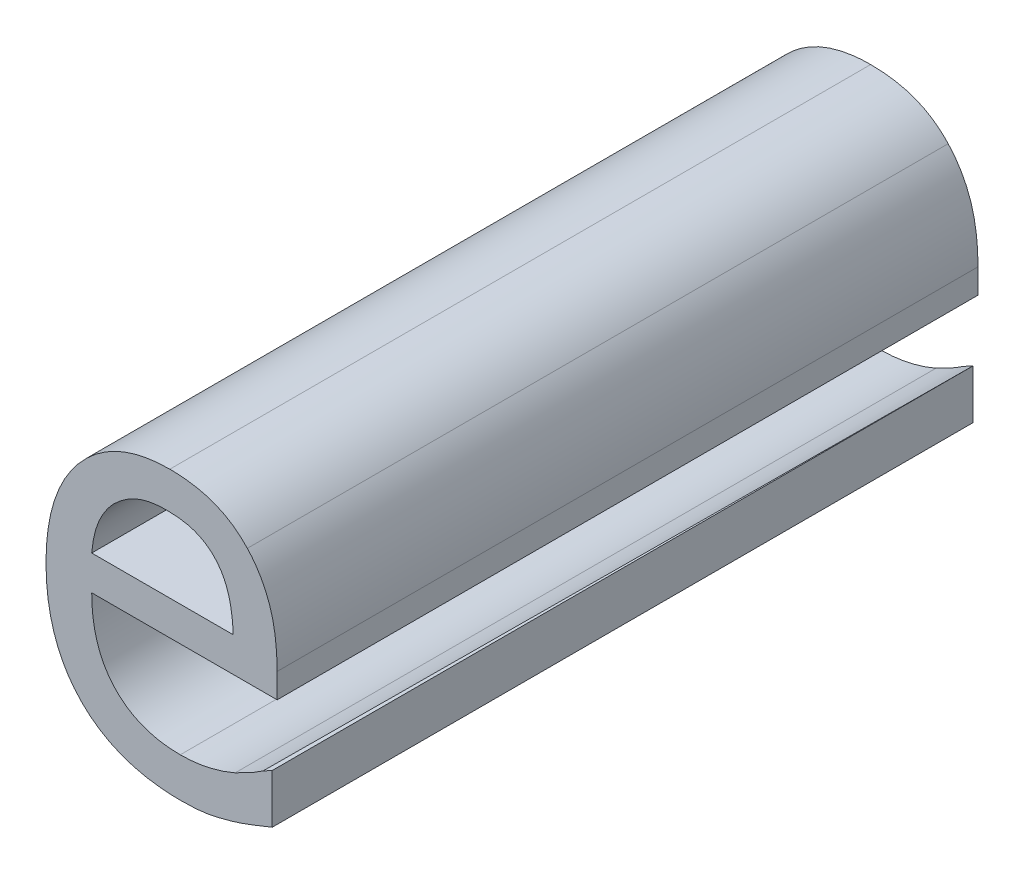
ISO-10303-21;
HEADER;
FILE_DESCRIPTION(('STEP AP214'),'2;1');
FILE_NAME('part.step','',(''),(''),'','','');
FILE_SCHEMA(('AUTOMOTIVE_DESIGN { 1 0 10303 214 1 1 1 1 }'));
ENDSEC;
DATA;
#1=APPLICATION_CONTEXT('core data for automotive mechanical design processes');
#2=APPLICATION_PROTOCOL_DEFINITION('international standard','automotive_design',2000,#1);
#3=PRODUCT_CONTEXT('',#1,'mechanical');
#4=PRODUCT('Part','Part','',(#3));
#5=PRODUCT_RELATED_PRODUCT_CATEGORY('part','',(#4));
#6=PRODUCT_DEFINITION_FORMATION('','',#4);
#7=PRODUCT_DEFINITION_CONTEXT('part definition',#1,'design');
#8=PRODUCT_DEFINITION('design','',#6,#7);
#9=PRODUCT_DEFINITION_SHAPE('','',#8);
#10=(LENGTH_UNIT() NAMED_UNIT(*) SI_UNIT(.MILLI.,.METRE.));
#11=(NAMED_UNIT(*) PLANE_ANGLE_UNIT() SI_UNIT($,.RADIAN.));
#12=(NAMED_UNIT(*) SI_UNIT($,.STERADIAN.) SOLID_ANGLE_UNIT());
#13=UNCERTAINTY_MEASURE_WITH_UNIT(LENGTH_MEASURE(1.E-05),#10,'distance_accuracy_value','');
#14=(GEOMETRIC_REPRESENTATION_CONTEXT(3) GLOBAL_UNCERTAINTY_ASSIGNED_CONTEXT((#13)) GLOBAL_UNIT_ASSIGNED_CONTEXT((#10,
#11,#12)) REPRESENTATION_CONTEXT('',''));
#15=CARTESIAN_POINT('',(0.,0.,0.));
#16=DIRECTION('',(0.,0.,1.));
#17=DIRECTION('',(1.,0.,0.));
#18=AXIS2_PLACEMENT_3D('',#15,#16,#17);
#19=CARTESIAN_POINT('',(-1.933754082946,-1.88252424241,0.));
#20=DIRECTION('',(0.,-1.,0.));
#21=DIRECTION('',(1.,0.,0.));
#22=AXIS2_PLACEMENT_3D('',#19,#20,#21);
#23=PLANE('',#22);
#24=DIRECTION('',(1.,0.,0.));
#25=VECTOR('',#24,1.);
#26=CARTESIAN_POINT('',(-1.928363909875,-1.88252424241,0.));
#27=LINE('',#26,#25);
#28=CARTESIAN_POINT('',(-1.933754082946,-1.88252424241,0.));
#29=VERTEX_POINT('',#28);
#30=CARTESIAN_POINT('',(-1.913569754734,-1.88252424241,0.));
#31=VERTEX_POINT('',#30);
#32=EDGE_CURVE('E11',#29,#31,#27,.T.);
#33=ORIENTED_EDGE('',*,*,#32,.F.);
#34=DIRECTION('',(0.,0.,1.));
#35=VECTOR('',#34,1.);
#36=CARTESIAN_POINT('',(-1.933754082946,-1.88252424241,0.));
#37=LINE('',#36,#35);
#38=CARTESIAN_POINT('',(-1.933754082946,-1.88252424241,0.1));
#39=VERTEX_POINT('',#38);
#40=EDGE_CURVE('E24',#29,#39,#37,.T.);
#41=ORIENTED_EDGE('',*,*,#40,.T.);
#42=DIRECTION('',(-1.,0.,0.));
#43=VECTOR('',#42,1.);
#44=CARTESIAN_POINT('',(-1.928363909875,-1.88252424241,0.1));
#45=LINE('',#44,#43);
#46=CARTESIAN_POINT('',(-1.913569754734,-1.88252424241,0.1));
#47=VERTEX_POINT('',#46);
#48=EDGE_CURVE('E572',#47,#39,#45,.T.);
#49=ORIENTED_EDGE('',*,*,#48,.F.);
#50=DIRECTION('',(0.,0.,1.));
#51=VECTOR('',#50,1.);
#52=CARTESIAN_POINT('',(-1.913569754734,-1.88252424241,0.));
#53=LINE('',#52,#51);
#54=EDGE_CURVE('E566',#31,#47,#53,.T.);
#55=ORIENTED_EDGE('',*,*,#54,.F.);
#56=EDGE_LOOP('',(#33,#41,#49,#55));
#57=FACE_BOUND('',#56,.T.);
#58=ADVANCED_FACE('F17',(#57),#23,.F.);
#59=CARTESIAN_POINT('',(-1.93061705034,-1.874888044621,0.));
#60=CARTESIAN_POINT('',(-1.93061705034,-1.874888044621,0.1));
#61=CARTESIAN_POINT('',(-1.932061736409,-1.876415284179,0.));
#62=CARTESIAN_POINT('',(-1.932061736409,-1.876415284179,0.1));
#63=CARTESIAN_POINT('',(-1.933547699222,-1.880088914467,0.));
#64=CARTESIAN_POINT('',(-1.933547699222,-1.880088914467,0.1));
#65=CARTESIAN_POINT('',(-1.933754082946,-1.88252424241,0.));
#66=CARTESIAN_POINT('',(-1.933754082946,-1.88252424241,0.1));
#67=B_SPLINE_SURFACE_WITH_KNOTS('',2,1,((#59,#60),(#61,#62),(#63,#64),(#65,#66)),.UNSPECIFIED.,
.F.,.F.,.F.,(3,1,3),(2,2),(0.,1.,2.),(0.,0.01),.UNSPECIFIED.);
#68=CARTESIAN_POINT('',(-1.93061705034,-1.874888044621,0.));
#69=CARTESIAN_POINT('',(-1.932061736409,-1.876415284179,0.));
#70=CARTESIAN_POINT('',(-1.933547699222,-1.880088914467,0.));
#71=CARTESIAN_POINT('',(-1.933754082946,-1.88252424241,0.));
#72=B_SPLINE_CURVE_WITH_KNOTS('',2,(#68,#69,#70,#71),.UNSPECIFIED.,.F.,.F.,(3,1,3),(0.,1.,2.),.UNSPECIFIED.);
#73=CARTESIAN_POINT('',(-1.93061705034,-1.874888044621,0.));
#74=VERTEX_POINT('',#73);
#75=EDGE_CURVE('E562',#74,#29,#72,.T.);
#76=DIRECTION('',(0.,0.,1.));
#77=VECTOR('',#76,1.);
#78=CARTESIAN_POINT('',(-1.93061705034,-1.874888044621,0.));
#79=LINE('',#78,#77);
#80=CARTESIAN_POINT('',(-1.93061705034,-1.874888044621,0.1));
#81=VERTEX_POINT('',#80);
#82=EDGE_CURVE('E556',#74,#81,#79,.T.);
#83=CARTESIAN_POINT('',(-1.933754082946,-1.88252424241,0.1));
#84=CARTESIAN_POINT('',(-1.933547699222,-1.880088914467,0.1));
#85=CARTESIAN_POINT('',(-1.932061736409,-1.876415284179,0.1));
#86=CARTESIAN_POINT('',(-1.93061705034,-1.874888044621,0.1));
#87=B_SPLINE_CURVE_WITH_KNOTS('',2,(#83,#84,#85,#86),.UNSPECIFIED.,.F.,.F.,(3,1,3),(-2.,-1.,0.),.UNSPECIFIED.);
#88=EDGE_CURVE('E549',#39,#81,#87,.T.);
#89=ORIENTED_EDGE('',*,*,#75,.F.);
#90=ORIENTED_EDGE('',*,*,#82,.T.);
#91=ORIENTED_EDGE('',*,*,#88,.F.);
#92=ORIENTED_EDGE('',*,*,#40,.F.);
#93=EDGE_LOOP('',(#89,#90,#91,#92));
#94=FACE_BOUND('',#93,.T.);
#95=ADVANCED_FACE('F309',(#94),#67,.F.);
#96=CARTESIAN_POINT('',(-1.922980852551,-1.871874842249,0.));
#97=CARTESIAN_POINT('',(-1.922980852551,-1.871874842249,0.1));
#98=CARTESIAN_POINT('',(-1.925540010729,-1.871874842249,0.));
#99=CARTESIAN_POINT('',(-1.925540010729,-1.871874842249,0.1));
#100=CARTESIAN_POINT('',(-1.929131087527,-1.873402081807,0.));
#101=CARTESIAN_POINT('',(-1.929131087527,-1.873402081807,0.1));
#102=CARTESIAN_POINT('',(-1.93061705034,-1.874888044621,0.));
#103=CARTESIAN_POINT('',(-1.93061705034,-1.874888044621,0.1));
#104=B_SPLINE_SURFACE_WITH_KNOTS('',2,1,((#96,#97),(#98,#99),(#100,#101),(#102,#103)),
.UNSPECIFIED.,.F.,.F.,.F.,(3,1,3),(2,2),(0.,1.,2.),(0.,0.01),.UNSPECIFIED.);
#105=CARTESIAN_POINT('',(-1.922980852551,-1.871874842249,0.));
#106=CARTESIAN_POINT('',(-1.925540010729,-1.871874842249,0.));
#107=CARTESIAN_POINT('',(-1.929131087527,-1.873402081807,0.));
#108=CARTESIAN_POINT('',(-1.93061705034,-1.874888044621,0.));
#109=B_SPLINE_CURVE_WITH_KNOTS('',2,(#105,#106,#107,#108),.UNSPECIFIED.,.F.,.F.,(3,1,3),(0.,1.,
2.),.UNSPECIFIED.);
#110=CARTESIAN_POINT('',(-1.922980852551,-1.871874842249,0.));
#111=VERTEX_POINT('',#110);
#112=EDGE_CURVE('E544',#111,#74,#109,.T.);
#113=DIRECTION('',(0.,0.,1.));
#114=VECTOR('',#113,1.);
#115=CARTESIAN_POINT('',(-1.922980852551,-1.871874842249,0.));
#116=LINE('',#115,#114);
#117=CARTESIAN_POINT('',(-1.922980852551,-1.871874842249,0.1));
#118=VERTEX_POINT('',#117);
#119=EDGE_CURVE('E538',#111,#118,#116,.T.);
#120=CARTESIAN_POINT('',(-1.93061705034,-1.874888044621,0.1));
#121=CARTESIAN_POINT('',(-1.929131087527,-1.873402081807,0.1));
#122=CARTESIAN_POINT('',(-1.925540010729,-1.871874842249,0.1));
#123=CARTESIAN_POINT('',(-1.922980852551,-1.871874842249,0.1));
#124=B_SPLINE_CURVE_WITH_KNOTS('',2,(#120,#121,#122,#123),.UNSPECIFIED.,.F.,.F.,(3,1,3),(-2.,
-1.,0.),.UNSPECIFIED.);
#125=EDGE_CURVE('E531',#81,#118,#124,.T.);
#126=ORIENTED_EDGE('',*,*,#112,.F.);
#127=ORIENTED_EDGE('',*,*,#119,.T.);
#128=ORIENTED_EDGE('',*,*,#125,.F.);
#129=ORIENTED_EDGE('',*,*,#82,.F.);
#130=EDGE_LOOP('',(#126,#127,#128,#129));
#131=FACE_BOUND('',#130,.T.);
#132=ADVANCED_FACE('F313',(#131),#104,.F.);
#133=CARTESIAN_POINT('',(-1.915757422209,-1.874846767876,0.));
#134=CARTESIAN_POINT('',(-1.915757422209,-1.874846767876,0.1));
#135=CARTESIAN_POINT('',(-1.916871894319,-1.873402081807,0.));
#136=CARTESIAN_POINT('',(-1.916871894319,-1.873402081807,0.1));
#137=CARTESIAN_POINT('',(-1.920380417628,-1.871874842249,0.));
#138=CARTESIAN_POINT('',(-1.920380417628,-1.871874842249,0.1));
#139=CARTESIAN_POINT('',(-1.922980852551,-1.871874842249,0.));
#140=CARTESIAN_POINT('',(-1.922980852551,-1.871874842249,0.1));
#141=B_SPLINE_SURFACE_WITH_KNOTS('',2,1,((#133,#134),(#135,#136),(#137,#138),(#139,#140)),
.UNSPECIFIED.,.F.,.F.,.F.,(3,1,3),(2,2),(0.,1.,2.),(0.,0.01),.UNSPECIFIED.);
#142=CARTESIAN_POINT('',(-1.915757422209,-1.874846767876,0.));
#143=CARTESIAN_POINT('',(-1.916871894319,-1.873402081807,0.));
#144=CARTESIAN_POINT('',(-1.920380417628,-1.871874842249,0.));
#145=CARTESIAN_POINT('',(-1.922980852551,-1.871874842249,0.));
#146=B_SPLINE_CURVE_WITH_KNOTS('',2,(#142,#143,#144,#145),.UNSPECIFIED.,.F.,.F.,(3,1,3),(0.,1.,
2.),.UNSPECIFIED.);
#147=CARTESIAN_POINT('',(-1.915757422209,-1.874846767876,0.));
#148=VERTEX_POINT('',#147);
#149=EDGE_CURVE('E526',#148,#111,#146,.T.);
#150=DIRECTION('',(0.,0.,1.));
#151=VECTOR('',#150,1.);
#152=CARTESIAN_POINT('',(-1.915757422209,-1.874846767876,0.));
#153=LINE('',#152,#151);
#154=CARTESIAN_POINT('',(-1.915757422209,-1.874846767876,0.1));
#155=VERTEX_POINT('',#154);
#156=EDGE_CURVE('E520',#148,#155,#153,.T.);
#157=CARTESIAN_POINT('',(-1.922980852551,-1.871874842249,0.1));
#158=CARTESIAN_POINT('',(-1.920380417628,-1.871874842249,0.1));
#159=CARTESIAN_POINT('',(-1.916871894319,-1.873402081807,0.1));
#160=CARTESIAN_POINT('',(-1.915757422209,-1.874846767876,0.1));
#161=B_SPLINE_CURVE_WITH_KNOTS('',2,(#157,#158,#159,#160),.UNSPECIFIED.,.F.,.F.,(3,1,3),(-2.,
-1.,0.),.UNSPECIFIED.);
#162=EDGE_CURVE('E513',#118,#155,#161,.T.);
#163=ORIENTED_EDGE('',*,*,#149,.F.);
#164=ORIENTED_EDGE('',*,*,#156,.T.);
#165=ORIENTED_EDGE('',*,*,#162,.F.);
#166=ORIENTED_EDGE('',*,*,#119,.F.);
#167=EDGE_LOOP('',(#163,#164,#165,#166));
#168=FACE_BOUND('',#167,.T.);
#169=ADVANCED_FACE('F318',(#168),#141,.F.);
#170=CARTESIAN_POINT('',(-1.913569754734,-1.88252424241,0.));
#171=CARTESIAN_POINT('',(-1.913569754734,-1.88252424241,0.1));
#172=CARTESIAN_POINT('',(-1.913652308224,-1.879923807487,0.));
#173=CARTESIAN_POINT('',(-1.913652308224,-1.879923807487,0.1));
#174=CARTESIAN_POINT('',(-1.914725503589,-1.876126346965,0.));
#175=CARTESIAN_POINT('',(-1.914725503589,-1.876126346965,0.1));
#176=CARTESIAN_POINT('',(-1.915757422209,-1.874846767876,0.));
#177=CARTESIAN_POINT('',(-1.915757422209,-1.874846767876,0.1));
#178=B_SPLINE_SURFACE_WITH_KNOTS('',2,1,((#170,#171),(#172,#173),(#174,#175),(#176,#177)),
.UNSPECIFIED.,.F.,.F.,.F.,(3,1,3),(2,2),(0.,1.,2.),(0.,0.01),.UNSPECIFIED.);
#179=CARTESIAN_POINT('',(-1.913569754734,-1.88252424241,0.));
#180=CARTESIAN_POINT('',(-1.913652308224,-1.879923807487,0.));
#181=CARTESIAN_POINT('',(-1.914725503589,-1.876126346965,0.));
#182=CARTESIAN_POINT('',(-1.915757422209,-1.874846767876,0.));
#183=B_SPLINE_CURVE_WITH_KNOTS('',2,(#179,#180,#181,#182),.UNSPECIFIED.,.F.,.F.,(3,1,3),(0.,1.,
2.),.UNSPECIFIED.);
#184=EDGE_CURVE('E506',#31,#148,#183,.T.);
#185=CARTESIAN_POINT('',(-1.915757422209,-1.874846767876,0.1));
#186=CARTESIAN_POINT('',(-1.914725503589,-1.876126346965,0.1));
#187=CARTESIAN_POINT('',(-1.913652308224,-1.879923807487,0.1));
#188=CARTESIAN_POINT('',(-1.913569754734,-1.88252424241,0.1));
#189=B_SPLINE_CURVE_WITH_KNOTS('',2,(#185,#186,#187,#188),.UNSPECIFIED.,.F.,.F.,(3,1,3),(-2.,
-1.,0.),.UNSPECIFIED.);
#190=EDGE_CURVE('E498',#155,#47,#189,.T.);
#191=ORIENTED_EDGE('',*,*,#184,.F.);
#192=ORIENTED_EDGE('',*,*,#54,.T.);
#193=ORIENTED_EDGE('',*,*,#190,.F.);
#194=ORIENTED_EDGE('',*,*,#156,.F.);
#195=EDGE_LOOP('',(#191,#192,#193,#194));
#196=FACE_BOUND('',#195,.T.);
#197=ADVANCED_FACE('F341',(#196),#178,.F.);
#198=CARTESIAN_POINT('',(-1.922609361847,-1.866591418914,0.));
#199=CARTESIAN_POINT('',(-1.922609361847,-1.866591418914,0.1));
#200=CARTESIAN_POINT('',(-1.930493220106,-1.866591418914,0.));
#201=CARTESIAN_POINT('',(-1.930493220106,-1.866591418914,0.1));
#202=CARTESIAN_POINT('',(-1.940275808626,-1.877653586523,0.));
#203=CARTESIAN_POINT('',(-1.940275808626,-1.877653586523,0.1));
#204=CARTESIAN_POINT('',(-1.940275808626,-1.88698213085,0.));
#205=CARTESIAN_POINT('',(-1.940275808626,-1.88698213085,0.1));
#206=B_SPLINE_SURFACE_WITH_KNOTS('',2,1,((#198,#199),(#200,#201),(#202,#203),(#204,#205)),
.UNSPECIFIED.,.F.,.F.,.F.,(3,1,3),(2,2),(-2.,-1.,0.),(0.,0.01),.UNSPECIFIED.);
#207=CARTESIAN_POINT('',(-1.940275808626,-1.88698213085,0.));
#208=CARTESIAN_POINT('',(-1.940275808626,-1.877653586523,0.));
#209=CARTESIAN_POINT('',(-1.930493220106,-1.866591418914,0.));
#210=CARTESIAN_POINT('',(-1.922609361847,-1.866591418914,0.));
#211=B_SPLINE_CURVE_WITH_KNOTS('',2,(#207,#208,#209,#210),.UNSPECIFIED.,.F.,.F.,(3,1,3),(0.,1.,
2.),.UNSPECIFIED.);
#212=CARTESIAN_POINT('',(-1.940275808626,-1.88698213085,0.));
#213=VERTEX_POINT('',#212);
#214=CARTESIAN_POINT('',(-1.922609361847,-1.866591418914,0.));
#215=VERTEX_POINT('',#214);
#216=EDGE_CURVE('E494',#213,#215,#211,.T.);
#217=DIRECTION('',(0.,0.,1.));
#218=VECTOR('',#217,1.);
#219=CARTESIAN_POINT('',(-1.940275808626,-1.88698213085,0.));
#220=LINE('',#219,#218);
#221=CARTESIAN_POINT('',(-1.940275808626,-1.88698213085,0.1));
#222=VERTEX_POINT('',#221);
#223=EDGE_CURVE('E489',#213,#222,#220,.T.);
#224=CARTESIAN_POINT('',(-1.922609361847,-1.866591418914,0.1));
#225=CARTESIAN_POINT('',(-1.930493220106,-1.866591418914,0.1));
#226=CARTESIAN_POINT('',(-1.940275808626,-1.877653586523,0.1));
#227=CARTESIAN_POINT('',(-1.940275808626,-1.88698213085,0.1));
#228=B_SPLINE_CURVE_WITH_KNOTS('',2,(#224,#225,#226,#227),.UNSPECIFIED.,.F.,.F.,(3,1,3),(-2.,
-1.,0.),.UNSPECIFIED.);
#229=CARTESIAN_POINT('',(-1.922609361847,-1.866591418914,0.1));
#230=VERTEX_POINT('',#229);
#231=EDGE_CURVE('E159',#230,#222,#228,.T.);
#232=DIRECTION('',(0.,0.,1.));
#233=VECTOR('',#232,1.);
#234=CARTESIAN_POINT('',(-1.922609361847,-1.866591418914,0.));
#235=LINE('',#234,#233);
#236=EDGE_CURVE('E480',#215,#230,#235,.T.);
#237=ORIENTED_EDGE('',*,*,#216,.F.);
#238=ORIENTED_EDGE('',*,*,#223,.T.);
#239=ORIENTED_EDGE('',*,*,#231,.F.);
#240=ORIENTED_EDGE('',*,*,#236,.F.);
#241=EDGE_LOOP('',(#237,#238,#239,#240));
#242=FACE_BOUND('',#241,.T.);
#243=ADVANCED_FACE('F352',(#242),#206,.T.);
#244=CARTESIAN_POINT('',(-1.911547194238,-1.870842923629,0.));
#245=CARTESIAN_POINT('',(-1.911547194238,-1.870842923629,0.1));
#246=CARTESIAN_POINT('',(-1.913569754734,-1.868655256154,0.));
#247=CARTESIAN_POINT('',(-1.913569754734,-1.868655256154,0.1));
#248=CARTESIAN_POINT('',(-1.919059561794,-1.866591418914,0.));
#249=CARTESIAN_POINT('',(-1.919059561794,-1.866591418914,0.1));
#250=CARTESIAN_POINT('',(-1.922609361847,-1.866591418914,0.));
#251=CARTESIAN_POINT('',(-1.922609361847,-1.866591418914,0.1));
#252=B_SPLINE_SURFACE_WITH_KNOTS('',2,1,((#244,#245),(#246,#247),(#248,#249),(#250,#251)),
.UNSPECIFIED.,.F.,.F.,.F.,(3,1,3),(2,2),(-2.,-1.,0.),(0.,0.01),.UNSPECIFIED.);
#253=CARTESIAN_POINT('',(-1.922609361847,-1.866591418914,0.));
#254=CARTESIAN_POINT('',(-1.919059561794,-1.866591418914,0.));
#255=CARTESIAN_POINT('',(-1.913569754734,-1.868655256154,0.));
#256=CARTESIAN_POINT('',(-1.911547194238,-1.870842923629,0.));
#257=B_SPLINE_CURVE_WITH_KNOTS('',2,(#253,#254,#255,#256),.UNSPECIFIED.,.F.,.F.,(3,1,3),(0.,1.,
2.),.UNSPECIFIED.);
#258=CARTESIAN_POINT('',(-1.911547194238,-1.870842923629,0.));
#259=VERTEX_POINT('',#258);
#260=EDGE_CURVE('E473',#215,#259,#257,.T.);
#261=CARTESIAN_POINT('',(-1.911547194238,-1.870842923629,0.1));
#262=CARTESIAN_POINT('',(-1.913569754734,-1.868655256154,0.1));
#263=CARTESIAN_POINT('',(-1.919059561794,-1.866591418914,0.1));
#264=CARTESIAN_POINT('',(-1.922609361847,-1.866591418914,0.1));
#265=B_SPLINE_CURVE_WITH_KNOTS('',2,(#261,#262,#263,#264),.UNSPECIFIED.,.F.,.F.,(3,1,3),(-2.,
-1.,0.),.UNSPECIFIED.);
#266=CARTESIAN_POINT('',(-1.911547194238,-1.870842923629,0.1));
#267=VERTEX_POINT('',#266);
#268=EDGE_CURVE('E469',#267,#230,#265,.T.);
#269=DIRECTION('',(0.,0.,1.));
#270=VECTOR('',#269,1.);
#271=CARTESIAN_POINT('',(-1.911547194238,-1.870842923629,0.));
#272=LINE('',#271,#270);
#273=EDGE_CURVE('E463',#259,#267,#272,.T.);
#274=ORIENTED_EDGE('',*,*,#260,.F.);
#275=ORIENTED_EDGE('',*,*,#236,.T.);
#276=ORIENTED_EDGE('',*,*,#268,.F.);
#277=ORIENTED_EDGE('',*,*,#273,.F.);
#278=EDGE_LOOP('',(#274,#275,#276,#277));
#279=FACE_BOUND('',#278,.T.);
#280=ADVANCED_FACE('F363',(#279),#252,.T.);
#281=CARTESIAN_POINT('',(-1.907295689523,-1.883927651734,0.));
#282=CARTESIAN_POINT('',(-1.907295689523,-1.883927651734,0.1));
#283=CARTESIAN_POINT('',(-1.907295689523,-1.87934593306,0.));
#284=CARTESIAN_POINT('',(-1.907295689523,-1.87934593306,0.1));
#285=CARTESIAN_POINT('',(-1.909483356998,-1.873030591104,0.));
#286=CARTESIAN_POINT('',(-1.909483356998,-1.873030591104,0.1));
#287=CARTESIAN_POINT('',(-1.911547194238,-1.870842923629,0.));
#288=CARTESIAN_POINT('',(-1.911547194238,-1.870842923629,0.1));
#289=B_SPLINE_SURFACE_WITH_KNOTS('',2,1,((#281,#282),(#283,#284),(#285,#286),(#287,#288)),
.UNSPECIFIED.,.F.,.F.,.F.,(3,1,3),(2,2),(-2.,-1.,0.),(0.,0.01),.UNSPECIFIED.);
#290=CARTESIAN_POINT('',(-1.911547194238,-1.870842923629,0.));
#291=CARTESIAN_POINT('',(-1.909483356998,-1.873030591104,0.));
#292=CARTESIAN_POINT('',(-1.907295689523,-1.87934593306,0.));
#293=CARTESIAN_POINT('',(-1.907295689523,-1.883927651734,0.));
#294=B_SPLINE_CURVE_WITH_KNOTS('',2,(#290,#291,#292,#293),.UNSPECIFIED.,.F.,.F.,(3,1,3),(0.,1.,
2.),.UNSPECIFIED.);
#295=CARTESIAN_POINT('',(-1.907295689523,-1.883927651734,0.));
#296=VERTEX_POINT('',#295);
#297=EDGE_CURVE('E456',#259,#296,#294,.T.);
#298=CARTESIAN_POINT('',(-1.907295689523,-1.883927651734,0.1));
#299=CARTESIAN_POINT('',(-1.907295689523,-1.87934593306,0.1));
#300=CARTESIAN_POINT('',(-1.909483356998,-1.873030591104,0.1));
#301=CARTESIAN_POINT('',(-1.911547194238,-1.870842923629,0.1));
#302=B_SPLINE_CURVE_WITH_KNOTS('',2,(#298,#299,#300,#301),.UNSPECIFIED.,.F.,.F.,(3,1,3),(-2.,
-1.,0.),.UNSPECIFIED.);
#303=CARTESIAN_POINT('',(-1.907295689523,-1.883927651734,0.1));
#304=VERTEX_POINT('',#303);
#305=EDGE_CURVE('E451',#304,#267,#302,.T.);
#306=DIRECTION('',(0.,0.,1.));
#307=VECTOR('',#306,1.);
#308=CARTESIAN_POINT('',(-1.907295689523,-1.883927651734,0.));
#309=LINE('',#308,#307);
#310=EDGE_CURVE('E448',#296,#304,#309,.T.);
#311=ORIENTED_EDGE('',*,*,#297,.F.);
#312=ORIENTED_EDGE('',*,*,#273,.T.);
#313=ORIENTED_EDGE('',*,*,#305,.F.);
#314=ORIENTED_EDGE('',*,*,#310,.F.);
#315=EDGE_LOOP('',(#311,#312,#313,#314));
#316=FACE_BOUND('',#315,.T.);
#317=ADVANCED_FACE('F374',(#316),#289,.T.);
#318=CARTESIAN_POINT('',(-1.907295689523,-1.887436175043,0.));
#319=DIRECTION('',(1.,0.,0.));
#320=DIRECTION('',(0.,1.,0.));
#321=AXIS2_PLACEMENT_3D('',#318,#319,#320);
#322=PLANE('',#321);
#323=DIRECTION('',(0.,-1.,0.));
#324=VECTOR('',#323,1.);
#325=CARTESIAN_POINT('',(-1.907295689523,-1.883927651734,0.));
#326=LINE('',#325,#324);
#327=CARTESIAN_POINT('',(-1.907295689523,-1.887436175043,0.));
#328=VERTEX_POINT('',#327);
#329=EDGE_CURVE('E446',#296,#328,#326,.T.);
#330=ORIENTED_EDGE('',*,*,#329,.F.);
#331=ORIENTED_EDGE('',*,*,#310,.T.);
#332=DIRECTION('',(0.,1.,0.));
#333=VECTOR('',#332,1.);
#334=CARTESIAN_POINT('',(-1.907295689523,-1.883927651734,0.1));
#335=LINE('',#334,#333);
#336=CARTESIAN_POINT('',(-1.907295689523,-1.887436175043,0.1));
#337=VERTEX_POINT('',#336);
#338=EDGE_CURVE('E443',#337,#304,#335,.T.);
#339=ORIENTED_EDGE('',*,*,#338,.F.);
#340=DIRECTION('',(0.,0.,1.));
#341=VECTOR('',#340,1.);
#342=CARTESIAN_POINT('',(-1.907295689523,-1.887436175043,0.));
#343=LINE('',#342,#341);
#344=EDGE_CURVE('E440',#328,#337,#343,.T.);
#345=ORIENTED_EDGE('',*,*,#344,.F.);
#346=EDGE_LOOP('',(#330,#331,#339,#345));
#347=FACE_BOUND('',#346,.T.);
#348=ADVANCED_FACE('F385',(#347),#322,.T.);
#349=CARTESIAN_POINT('',(-1.933754082946,-1.887436175043,0.));
#350=DIRECTION('',(0.,-1.,0.));
#351=DIRECTION('',(1.,0.,0.));
#352=AXIS2_PLACEMENT_3D('',#349,#350,#351);
#353=PLANE('',#352);
#354=DIRECTION('',(-1.,0.,0.));
#355=VECTOR('',#354,1.);
#356=CARTESIAN_POINT('',(-1.907295689523,-1.887436175043,0.));
#357=LINE('',#356,#355);
#358=CARTESIAN_POINT('',(-1.933754082946,-1.887436175043,0.));
#359=VERTEX_POINT('',#358);
#360=EDGE_CURVE('E438',#328,#359,#357,.T.);
#361=ORIENTED_EDGE('',*,*,#360,.F.);
#362=ORIENTED_EDGE('',*,*,#344,.T.);
#363=DIRECTION('',(1.,0.,0.));
#364=VECTOR('',#363,1.);
#365=CARTESIAN_POINT('',(-1.907295689523,-1.887436175043,0.1));
#366=LINE('',#365,#364);
#367=CARTESIAN_POINT('',(-1.933754082946,-1.887436175043,0.1));
#368=VERTEX_POINT('',#367);
#369=EDGE_CURVE('E424',#368,#337,#366,.T.);
#370=ORIENTED_EDGE('',*,*,#369,.F.);
#371=DIRECTION('',(0.,0.,1.));
#372=VECTOR('',#371,1.);
#373=CARTESIAN_POINT('',(-1.933754082946,-1.887436175043,0.));
#374=LINE('',#373,#372);
#375=EDGE_CURVE('E417',#359,#368,#374,.T.);
#376=ORIENTED_EDGE('',*,*,#375,.F.);
#377=EDGE_LOOP('',(#361,#362,#370,#376));
#378=FACE_BOUND('',#377,.T.);
#379=ADVANCED_FACE('F394',(#378),#353,.T.);
#380=CARTESIAN_POINT('',(-1.921123399034,-1.90114005432,0.));
#381=CARTESIAN_POINT('',(-1.921123399034,-1.90114005432,0.1));
#382=CARTESIAN_POINT('',(-1.927067250287,-1.90114005432,0.));
#383=CARTESIAN_POINT('',(-1.927067250287,-1.90114005432,0.1));
#384=CARTESIAN_POINT('',(-1.933754082946,-1.894081730957,0.));
#385=CARTESIAN_POINT('',(-1.933754082946,-1.894081730957,0.1));
#386=CARTESIAN_POINT('',(-1.933754082946,-1.887436175043,0.));
#387=CARTESIAN_POINT('',(-1.933754082946,-1.887436175043,0.1));
#388=B_SPLINE_SURFACE_WITH_KNOTS('',2,1,((#380,#381),(#382,#383),(#384,#385),(#386,#387)),
.UNSPECIFIED.,.F.,.F.,.F.,(3,1,3),(2,2),(-2.,-1.,0.),(0.,0.01),.UNSPECIFIED.);
#389=CARTESIAN_POINT('',(-1.933754082946,-1.887436175043,0.));
#390=CARTESIAN_POINT('',(-1.933754082946,-1.894081730957,0.));
#391=CARTESIAN_POINT('',(-1.927067250287,-1.90114005432,0.));
#392=CARTESIAN_POINT('',(-1.921123399034,-1.90114005432,0.));
#393=B_SPLINE_CURVE_WITH_KNOTS('',2,(#389,#390,#391,#392),.UNSPECIFIED.,.F.,.F.,(3,1,3),(0.,1.,
2.),.UNSPECIFIED.);
#394=CARTESIAN_POINT('',(-1.921123399034,-1.90114005432,0.));
#395=VERTEX_POINT('',#394);
#396=EDGE_CURVE('E415',#359,#395,#393,.T.);
#397=CARTESIAN_POINT('',(-1.921123399034,-1.90114005432,0.1));
#398=CARTESIAN_POINT('',(-1.927067250287,-1.90114005432,0.1));
#399=CARTESIAN_POINT('',(-1.933754082946,-1.894081730957,0.1));
#400=CARTESIAN_POINT('',(-1.933754082946,-1.887436175043,0.1));
#401=B_SPLINE_CURVE_WITH_KNOTS('',2,(#397,#398,#399,#400),.UNSPECIFIED.,.F.,.F.,(3,1,3),(-2.,
-1.,0.),.UNSPECIFIED.);
#402=CARTESIAN_POINT('',(-1.921123399034,-1.90114005432,0.1));
#403=VERTEX_POINT('',#402);
#404=EDGE_CURVE('E422',#403,#368,#401,.T.);
#405=DIRECTION('',(0.,0.,1.));
#406=VECTOR('',#405,1.);
#407=CARTESIAN_POINT('',(-1.921123399034,-1.90114005432,0.));
#408=LINE('',#407,#406);
#409=EDGE_CURVE('E420',#395,#403,#408,.T.);
#410=ORIENTED_EDGE('',*,*,#396,.F.);
#411=ORIENTED_EDGE('',*,*,#375,.T.);
#412=ORIENTED_EDGE('',*,*,#404,.F.);
#413=ORIENTED_EDGE('',*,*,#409,.F.);
#414=EDGE_LOOP('',(#410,#411,#412,#413));
#415=FACE_BOUND('',#414,.T.);
#416=ADVANCED_FACE('F397',(#415),#388,.T.);
#417=CARTESIAN_POINT('',(-1.91328081752,-1.899447707782,0.));
#418=CARTESIAN_POINT('',(-1.91328081752,-1.899447707782,0.1));
#419=CARTESIAN_POINT('',(-1.914931887313,-1.900190689189,0.));
#420=CARTESIAN_POINT('',(-1.914931887313,-1.900190689189,0.1));
#421=CARTESIAN_POINT('',(-1.919018285049,-1.90114005432,0.));
#422=CARTESIAN_POINT('',(-1.919018285049,-1.90114005432,0.1));
#423=CARTESIAN_POINT('',(-1.921123399034,-1.90114005432,0.));
#424=CARTESIAN_POINT('',(-1.921123399034,-1.90114005432,0.1));
#425=B_SPLINE_SURFACE_WITH_KNOTS('',2,1,((#417,#418),(#419,#420),(#421,#422),(#423,#424)),
.UNSPECIFIED.,.F.,.F.,.F.,(3,1,3),(2,2),(-2.,-1.,0.),(0.,0.01),.UNSPECIFIED.);
#426=CARTESIAN_POINT('',(-1.921123399034,-1.90114005432,0.));
#427=CARTESIAN_POINT('',(-1.919018285049,-1.90114005432,0.));
#428=CARTESIAN_POINT('',(-1.914931887313,-1.900190689189,0.));
#429=CARTESIAN_POINT('',(-1.91328081752,-1.899447707782,0.));
#430=B_SPLINE_CURVE_WITH_KNOTS('',2,(#426,#427,#428,#429),.UNSPECIFIED.,.F.,.F.,(3,1,3),(0.,1.,
2.),.UNSPECIFIED.);
#431=CARTESIAN_POINT('',(-1.91328081752,-1.899447707782,0.));
#432=VERTEX_POINT('',#431);
#433=EDGE_CURVE('E592',#395,#432,#430,.T.);
#434=CARTESIAN_POINT('',(-1.91328081752,-1.899447707782,0.1));
#435=CARTESIAN_POINT('',(-1.914931887313,-1.900190689189,0.1));
#436=CARTESIAN_POINT('',(-1.919018285049,-1.90114005432,0.1));
#437=CARTESIAN_POINT('',(-1.921123399034,-1.90114005432,0.1));
#438=B_SPLINE_CURVE_WITH_KNOTS('',2,(#434,#435,#436,#437),.UNSPECIFIED.,.F.,.F.,(3,1,3),(-2.,
-1.,0.),.UNSPECIFIED.);
#439=CARTESIAN_POINT('',(-1.91328081752,-1.899447707782,0.1));
#440=VERTEX_POINT('',#439);
#441=EDGE_CURVE('E590',#440,#403,#438,.T.);
#442=DIRECTION('',(0.,0.,1.));
#443=VECTOR('',#442,1.);
#444=CARTESIAN_POINT('',(-1.91328081752,-1.899447707782,0.));
#445=LINE('',#444,#443);
#446=EDGE_CURVE('E601',#432,#440,#445,.T.);
#447=ORIENTED_EDGE('',*,*,#433,.F.);
#448=ORIENTED_EDGE('',*,*,#409,.T.);
#449=ORIENTED_EDGE('',*,*,#441,.F.);
#450=ORIENTED_EDGE('',*,*,#446,.F.);
#451=EDGE_LOOP('',(#447,#448,#449,#450));
#452=FACE_BOUND('',#451,.T.);
#453=ADVANCED_FACE('F231',(#452),#425,.T.);
#454=CARTESIAN_POINT('',(-1.908368884888,-1.896517058901,0.));
#455=CARTESIAN_POINT('',(-1.908368884888,-1.896517058901,0.1));
#456=CARTESIAN_POINT('',(-1.909153143039,-1.897177486818,0.));
#457=CARTESIAN_POINT('',(-1.909153143039,-1.897177486818,0.1));
#458=CARTESIAN_POINT('',(-1.911547194238,-1.898622172886,0.));
#459=CARTESIAN_POINT('',(-1.911547194238,-1.898622172886,0.1));
#460=CARTESIAN_POINT('',(-1.91328081752,-1.899447707782,0.));
#461=CARTESIAN_POINT('',(-1.91328081752,-1.899447707782,0.1));
#462=B_SPLINE_SURFACE_WITH_KNOTS('',2,1,((#454,#455),(#456,#457),(#458,#459),(#460,#461)),
.UNSPECIFIED.,.F.,.F.,.F.,(3,1,3),(2,2),(-2.,-1.,0.),(0.,0.01),.UNSPECIFIED.);
#463=CARTESIAN_POINT('',(-1.91328081752,-1.899447707782,0.));
#464=CARTESIAN_POINT('',(-1.911547194238,-1.898622172886,0.));
#465=CARTESIAN_POINT('',(-1.909153143039,-1.897177486818,0.));
#466=CARTESIAN_POINT('',(-1.908368884888,-1.896517058901,0.));
#467=B_SPLINE_CURVE_WITH_KNOTS('',2,(#463,#464,#465,#466),.UNSPECIFIED.,.F.,.F.,(3,1,3),(0.,1.,
2.),.UNSPECIFIED.);
#468=CARTESIAN_POINT('',(-1.907997394185,-1.896517058901,0.));
#469=VERTEX_POINT('',#468);
#470=EDGE_CURVE('E610',#432,#469,#467,.T.);
#471=CARTESIAN_POINT('',(-1.91328081752002,-1.89944770778201,0.1));
#472=CARTESIAN_POINT('',(-1.91299257506647,-1.89931036380988,0.1));
#473=CARTESIAN_POINT('',(-1.91270545799155,-1.89917057408869,0.1));
#474=CARTESIAN_POINT('',(-1.91215541452655,-1.89889509151787,0.1));
#475=CARTESIAN_POINT('',(-1.9118922604519,-1.8987598520444,0.1));
#476=CARTESIAN_POINT('',(-1.91139006567496,-1.89849357992938,0.1));
#477=CARTESIAN_POINT('',(-1.91115075785295,-1.89836305453996,0.1));
#478=CARTESIAN_POINT('',(-1.9106964598874,-1.89810578717532,0.1));
#479=CARTESIAN_POINT('',(-1.91048112413261,-1.89797965806894,0.1));
#480=CARTESIAN_POINT('',(-1.91007123843399,-1.89773033901643,0.1));
#481=CARTESIAN_POINT('',(-1.90987636873426,-1.89760767592007,0.1));
#482=CARTESIAN_POINT('',(-1.90950525205408,-1.89736475157113,0.1));
#483=CARTESIAN_POINT('',(-1.90932868863089,-1.89724497580367,0.1));
#484=CARTESIAN_POINT('',(-1.90899435872126,-1.89700756471911,0.1));
#485=CARTESIAN_POINT('',(-1.90883619890287,-1.89689048854182,0.1));
#486=CARTESIAN_POINT('',(-1.90853813440086,-1.89665837620713,0.1));
#487=CARTESIAN_POINT('',(-1.90839777814883,-1.89654391807182,0.1));
#488=CARTESIAN_POINT('',(-1.90826049018865,-1.89642577915413,0.1));
#489=B_SPLINE_CURVE_WITH_KNOTS('',3,(#471,#472,#473,#474,#475,#476,#477,#478,#479,#480,#481,
#482,#483,#484,#485,#486,#487,#488),.UNSPECIFIED.,.F.,.F.,(4,2,2,2,2,2,2,2,4),(0.,
0.000957914407439207,0.00184546187589798,0.00266312307698997,0.00341166580944128,
0.00410232861440253,0.00474225582006242,0.00533237019109577,0.00587556146438106),.UNSPECIFIED.);
#490=CARTESIAN_POINT('',(-1.907997394185,-1.896517058901,0.1));
#491=VERTEX_POINT('',#490);
#492=EDGE_CURVE('E257',#491,#440,#489,.F.);
#493=CARTESIAN_POINT('',(-1.90826049018865,-1.89642577915413,0.1));
#494=CARTESIAN_POINT('',(-1.90825847114987,-1.89642407891094,0.0958333333333334));
#495=CARTESIAN_POINT('',(-1.90825645211108,-1.89642237866775,0.0916666666666667));
#496=CARTESIAN_POINT('',(-1.90825241403351,-1.89641897818138,0.0833333333333333));
#497=CARTESIAN_POINT('',(-1.90825039499473,-1.89641727793819,0.0791666666666667));
#498=CARTESIAN_POINT('',(-1.90824635691715,-1.89641387745181,0.0708333333333333));
#499=CARTESIAN_POINT('',(-1.90824433787837,-1.89641217720862,0.0666666666666667));
#500=CARTESIAN_POINT('',(-1.9082402998008,-1.89640877672224,0.0583333333333333));
#501=CARTESIAN_POINT('',(-1.90823828076201,-1.89640707647905,0.0541666666666667));
#502=CARTESIAN_POINT('',(-1.90823424268444,-1.89640367599268,0.0458333333333333));
#503=CARTESIAN_POINT('',(-1.90823222364566,-1.89640197574949,0.0416666666666667));
#504=CARTESIAN_POINT('',(-1.90822818556808,-1.89639857526311,0.0333333333333333));
#505=CARTESIAN_POINT('',(-1.9082261665293,-1.89639687501992,0.0291666666666667));
#506=CARTESIAN_POINT('',(-1.90822212845173,-1.89639347453354,0.0208333333333333));
#507=CARTESIAN_POINT('',(-1.90822010941294,-1.89639177429036,0.0166666666666667));
#508=CARTESIAN_POINT('',(-1.90821607133537,-1.89638837380398,0.00833333333333333));
#509=CARTESIAN_POINT('',(-1.90821405229659,-1.89638667356079,0.00416666666666667));
#510=CARTESIAN_POINT('',(-1.9082120332578,-1.8963849733176,0.));
#511=B_SPLINE_CURVE_WITH_KNOTS('',3,(#493,#494,#495,#496,#497,#498,#499,#500,#501,#502,#503,
#504,#505,#506,#507,#508,#509,#510),.UNSPECIFIED.,.F.,.F.,(4,2,2,2,2,2,2,2,4),(0.,
0.0125000025082438,0.0250000050164875,0.0375000075247313,0.0500000100329751,0.0625000125412189,
0.0750000150494627,0.0875000175577064,0.10000002006595),.UNSPECIFIED.);
#512=EDGE_CURVE('E211',#469,#491,#511,.F.);
#513=CARTESIAN_POINT('',(-1.90818066293176,-1.89635855620092,0.));
#514=CARTESIAN_POINT('',(-1.90818066293176,-1.89635855620092,0.1));
#515=CARTESIAN_POINT('',(-1.90827477390988,-1.89643780755096,0.));
#516=CARTESIAN_POINT('',(-1.90827477390988,-1.89643780755096,0.1));
#517=CARTESIAN_POINT('',(-1.908368884888,-1.896517058901,0.));
#518=CARTESIAN_POINT('',(-1.908368884888,-1.896517058901,0.1));
#519=CARTESIAN_POINT('',(-1.909153143039,-1.897177486818,0.));
#520=CARTESIAN_POINT('',(-1.909153143039,-1.897177486818,0.1));
#521=CARTESIAN_POINT('',(-1.911547194238,-1.898622172886,0.));
#522=CARTESIAN_POINT('',(-1.911547194238,-1.898622172886,0.1));
#523=CARTESIAN_POINT('',(-1.91328081752,-1.899447707782,0.));
#524=CARTESIAN_POINT('',(-1.91328081752,-1.899447707782,0.1));
#525=B_SPLINE_SURFACE_WITH_KNOTS('',2,1,((#513,#514),(#515,#516),(#517,#518),(#519,#520),(#521,
#522),(#523,#524)),.UNSPECIFIED.,.F.,.F.,.F.,(3,2,1,3),(2,2),(-2.12,-2.,-1.,0.),(0.,0.01),.UNSPECIFIED.);
#526=ORIENTED_EDGE('',*,*,#470,.F.);
#527=ORIENTED_EDGE('',*,*,#446,.T.);
#528=ORIENTED_EDGE('',*,*,#492,.F.);
#529=ORIENTED_EDGE('',*,*,#512,.F.);
#530=EDGE_LOOP('',(#526,#527,#528,#529));
#531=FACE_BOUND('',#530,.T.);
#532=ADVANCED_FACE('F218',(#531),#525,.T.);
#533=CARTESIAN_POINT('',(-1.907997394185,-1.903534105519,0.));
#534=DIRECTION('',(1.,0.,0.));
#535=DIRECTION('',(0.,1.,0.));
#536=AXIS2_PLACEMENT_3D('',#533,#534,#535);
#537=PLANE('',#536);
#538=DIRECTION('',(0.,-1.,0.));
#539=VECTOR('',#538,1.);
#540=CARTESIAN_POINT('',(-1.907997394185,-1.896517058901,0.));
#541=LINE('',#540,#539);
#542=CARTESIAN_POINT('',(-1.907997394185,-1.903534105519,0.));
#543=VERTEX_POINT('',#542);
#544=EDGE_CURVE('E207',#469,#543,#541,.T.);
#545=ORIENTED_EDGE('',*,*,#544,.F.);
#546=ORIENTED_EDGE('',*,*,#512,.T.);
#547=DIRECTION('',(0.,1.,0.));
#548=VECTOR('',#547,1.);
#549=CARTESIAN_POINT('',(-1.907997394185,-1.896517058901,0.1));
#550=LINE('',#549,#548);
#551=CARTESIAN_POINT('',(-1.907997394185,-1.903534105519,0.1));
#552=VERTEX_POINT('',#551);
#553=EDGE_CURVE('E202',#552,#491,#550,.T.);
#554=ORIENTED_EDGE('',*,*,#553,.F.);
#555=DIRECTION('',(0.,0.,1.));
#556=VECTOR('',#555,1.);
#557=CARTESIAN_POINT('',(-1.907997394185,-1.903534105519,0.));
#558=LINE('',#557,#556);
#559=EDGE_CURVE('E196',#543,#552,#558,.T.);
#560=ORIENTED_EDGE('',*,*,#559,.F.);
#561=EDGE_LOOP('',(#545,#546,#554,#560));
#562=FACE_BOUND('',#561,.T.);
#563=ADVANCED_FACE('F230',(#562),#537,.T.);
#564=CARTESIAN_POINT('',(-1.913817415203,-1.905680496249,0.));
#565=CARTESIAN_POINT('',(-1.913817415203,-1.905680496249,0.1));
#566=CARTESIAN_POINT('',(-1.912496559369,-1.905309005545,0.));
#567=CARTESIAN_POINT('',(-1.912496559369,-1.905309005545,0.1));
#568=CARTESIAN_POINT('',(-1.909111866294,-1.903988149712,0.));
#569=CARTESIAN_POINT('',(-1.909111866294,-1.903988149712,0.1));
#570=CARTESIAN_POINT('',(-1.907997394185,-1.903534105519,0.));
#571=CARTESIAN_POINT('',(-1.907997394185,-1.903534105519,0.1));
#572=B_SPLINE_SURFACE_WITH_KNOTS('',2,1,((#564,#565),(#566,#567),(#568,#569),(#570,#571)),
.UNSPECIFIED.,.F.,.F.,.F.,(3,1,3),(2,2),(-2.,-1.,0.),(0.,0.01),.UNSPECIFIED.);
#573=CARTESIAN_POINT('',(-1.907997394185,-1.903534105519,0.));
#574=CARTESIAN_POINT('',(-1.909111866294,-1.903988149712,0.));
#575=CARTESIAN_POINT('',(-1.912496559369,-1.905309005545,0.));
#576=CARTESIAN_POINT('',(-1.913817415203,-1.905680496249,0.));
#577=B_SPLINE_CURVE_WITH_KNOTS('',2,(#573,#574,#575,#576),.UNSPECIFIED.,.F.,.F.,(3,1,3),(0.,1.,
2.),.UNSPECIFIED.);
#578=CARTESIAN_POINT('',(-1.913817415203,-1.905680496249,0.));
#579=VERTEX_POINT('',#578);
#580=EDGE_CURVE('E189',#543,#579,#577,.T.);
#581=CARTESIAN_POINT('',(-1.913817415203,-1.905680496249,0.1));
#582=CARTESIAN_POINT('',(-1.912496559369,-1.905309005545,0.1));
#583=CARTESIAN_POINT('',(-1.909111866294,-1.903988149712,0.1));
#584=CARTESIAN_POINT('',(-1.907997394185,-1.903534105519,0.1));
#585=B_SPLINE_CURVE_WITH_KNOTS('',2,(#581,#582,#583,#584),.UNSPECIFIED.,.F.,.F.,(3,1,3),(-2.,
-1.,0.),.UNSPECIFIED.);
#586=CARTESIAN_POINT('',(-1.913817415203,-1.905680496249,0.1));
#587=VERTEX_POINT('',#586);
#588=EDGE_CURVE('E185',#587,#552,#585,.T.);
#589=DIRECTION('',(0.,0.,1.));
#590=VECTOR('',#589,1.);
#591=CARTESIAN_POINT('',(-1.913817415203,-1.905680496249,0.));
#592=LINE('',#591,#590);
#593=EDGE_CURVE('E140',#579,#587,#592,.T.);
#594=ORIENTED_EDGE('',*,*,#580,.F.);
#595=ORIENTED_EDGE('',*,*,#559,.T.);
#596=ORIENTED_EDGE('',*,*,#588,.F.);
#597=ORIENTED_EDGE('',*,*,#593,.F.);
#598=EDGE_LOOP('',(#594,#595,#596,#597));
#599=FACE_BOUND('',#598,.T.);
#600=ADVANCED_FACE('F287',(#599),#572,.T.);
#601=CARTESIAN_POINT('',(-1.921040845544,-1.906753691614,0.));
#602=CARTESIAN_POINT('',(-1.921040845544,-1.906753691614,0.1));
#603=CARTESIAN_POINT('',(-1.918729347835,-1.906753691614,0.));
#604=CARTESIAN_POINT('',(-1.918729347835,-1.906753691614,0.1));
#605=CARTESIAN_POINT('',(-1.915674868719,-1.906217093931,0.));
#606=CARTESIAN_POINT('',(-1.915674868719,-1.906217093931,0.1));
#607=CARTESIAN_POINT('',(-1.913817415203,-1.905680496249,0.));
#608=CARTESIAN_POINT('',(-1.913817415203,-1.905680496249,0.1));
#609=B_SPLINE_SURFACE_WITH_KNOTS('',2,1,((#601,#602),(#603,#604),(#605,#606),(#607,#608)),
.UNSPECIFIED.,.F.,.F.,.F.,(3,1,3),(2,2),(-2.,-1.,0.),(0.,0.01),.UNSPECIFIED.);
#610=CARTESIAN_POINT('',(-1.913817415203,-1.905680496249,0.));
#611=CARTESIAN_POINT('',(-1.915674868719,-1.906217093931,0.));
#612=CARTESIAN_POINT('',(-1.918729347835,-1.906753691614,0.));
#613=CARTESIAN_POINT('',(-1.921040845544,-1.906753691614,0.));
#614=B_SPLINE_CURVE_WITH_KNOTS('',2,(#610,#611,#612,#613),.UNSPECIFIED.,.F.,.F.,(3,1,3),(0.,1.,
2.),.UNSPECIFIED.);
#615=CARTESIAN_POINT('',(-1.921040845544,-1.906753691614,0.));
#616=VERTEX_POINT('',#615);
#617=EDGE_CURVE('E144',#579,#616,#614,.T.);
#618=CARTESIAN_POINT('',(-1.921040845544,-1.906753691614,0.1));
#619=CARTESIAN_POINT('',(-1.918729347835,-1.906753691614,0.1));
#620=CARTESIAN_POINT('',(-1.915674868719,-1.906217093931,0.1));
#621=CARTESIAN_POINT('',(-1.913817415203,-1.905680496249,0.1));
#622=B_SPLINE_CURVE_WITH_KNOTS('',2,(#618,#619,#620,#621),.UNSPECIFIED.,.F.,.F.,(3,1,3),(-2.,
-1.,0.),.UNSPECIFIED.);
#623=CARTESIAN_POINT('',(-1.921040845544,-1.906753691614,0.1));
#624=VERTEX_POINT('',#623);
#625=EDGE_CURVE('E133',#624,#587,#622,.T.);
#626=DIRECTION('',(0.,0.,1.));
#627=VECTOR('',#626,1.);
#628=CARTESIAN_POINT('',(-1.921040845544,-1.906753691614,0.));
#629=LINE('',#628,#627);
#630=EDGE_CURVE('E137',#616,#624,#629,.T.);
#631=ORIENTED_EDGE('',*,*,#617,.F.);
#632=ORIENTED_EDGE('',*,*,#593,.T.);
#633=ORIENTED_EDGE('',*,*,#625,.F.);
#634=ORIENTED_EDGE('',*,*,#630,.F.);
#635=EDGE_LOOP('',(#631,#632,#633,#634));
#636=FACE_BOUND('',#635,.T.);
#637=ADVANCED_FACE('F136',(#636),#609,.T.);
#638=CARTESIAN_POINT('',(-1.940275808626,-1.88698213085,0.));
#639=CARTESIAN_POINT('',(-1.940275808626,-1.88698213085,0.1));
#640=CARTESIAN_POINT('',(-1.940275808626,-1.896475782156,0.));
#641=CARTESIAN_POINT('',(-1.940275808626,-1.896475782156,0.1));
#642=CARTESIAN_POINT('',(-1.930204282892,-1.906753691614,0.));
#643=CARTESIAN_POINT('',(-1.930204282892,-1.906753691614,0.1));
#644=CARTESIAN_POINT('',(-1.921040845544,-1.906753691614,0.));
#645=CARTESIAN_POINT('',(-1.921040845544,-1.906753691614,0.1));
#646=B_SPLINE_SURFACE_WITH_KNOTS('',2,1,((#638,#639),(#640,#641),(#642,#643),(#644,#645)),
.UNSPECIFIED.,.F.,.F.,.F.,(3,1,3),(2,2),(-2.,-1.,0.),(0.,0.01),.UNSPECIFIED.);
#647=CARTESIAN_POINT('',(-1.921040845544,-1.906753691614,0.));
#648=CARTESIAN_POINT('',(-1.930204282892,-1.906753691614,0.));
#649=CARTESIAN_POINT('',(-1.940275808626,-1.896475782156,0.));
#650=CARTESIAN_POINT('',(-1.940275808626,-1.88698213085,0.));
#651=B_SPLINE_CURVE_WITH_KNOTS('',2,(#647,#648,#649,#650),.UNSPECIFIED.,.F.,.F.,(3,1,3),(0.,1.,
2.),.UNSPECIFIED.);
#652=EDGE_CURVE('E152',#616,#213,#651,.T.);
#653=CARTESIAN_POINT('',(-1.940275808626,-1.88698213085,0.1));
#654=CARTESIAN_POINT('',(-1.940275808626,-1.896475782156,0.1));
#655=CARTESIAN_POINT('',(-1.930204282892,-1.906753691614,0.1));
#656=CARTESIAN_POINT('',(-1.921040845544,-1.906753691614,0.1));
#657=B_SPLINE_CURVE_WITH_KNOTS('',2,(#653,#654,#655,#656),.UNSPECIFIED.,.F.,.F.,(3,1,3),(-2.,
-1.,0.),.UNSPECIFIED.);
#658=EDGE_CURVE('E150',#222,#624,#657,.T.);
#659=ORIENTED_EDGE('',*,*,#652,.F.);
#660=ORIENTED_EDGE('',*,*,#630,.T.);
#661=ORIENTED_EDGE('',*,*,#658,.F.);
#662=ORIENTED_EDGE('',*,*,#223,.F.);
#663=EDGE_LOOP('',(#659,#660,#661,#662));
#664=FACE_BOUND('',#663,.T.);
#665=ADVANCED_FACE('F148',(#664),#646,.T.);
#666=CARTESIAN_POINT('',(-1.922973736804,-1.889123797441,0.));
#667=DIRECTION('',(0.,0.,1.));
#668=DIRECTION('',(1.,0.,0.));
#669=AXIS2_PLACEMENT_3D('',#666,#667,#668);
#670=PLANE('',#669);
#671=ORIENTED_EDGE('',*,*,#544,.T.);
#672=ORIENTED_EDGE('',*,*,#580,.T.);
#673=ORIENTED_EDGE('',*,*,#617,.T.);
#674=ORIENTED_EDGE('',*,*,#652,.T.);
#675=ORIENTED_EDGE('',*,*,#216,.T.);
#676=ORIENTED_EDGE('',*,*,#260,.T.);
#677=ORIENTED_EDGE('',*,*,#297,.T.);
#678=ORIENTED_EDGE('',*,*,#329,.T.);
#679=ORIENTED_EDGE('',*,*,#360,.T.);
#680=ORIENTED_EDGE('',*,*,#396,.T.);
#681=ORIENTED_EDGE('',*,*,#433,.T.);
#682=ORIENTED_EDGE('',*,*,#470,.T.);
#683=EDGE_LOOP('',(#671,#672,#673,#674,#675,#676,#677,#678,#679,#680,#681,#682));
#684=FACE_BOUND('',#683,.T.);
#685=ORIENTED_EDGE('',*,*,#32,.T.);
#686=ORIENTED_EDGE('',*,*,#184,.T.);
#687=ORIENTED_EDGE('',*,*,#149,.T.);
#688=ORIENTED_EDGE('',*,*,#112,.T.);
#689=ORIENTED_EDGE('',*,*,#75,.T.);
#690=EDGE_LOOP('',(#685,#686,#687,#688,#689));
#691=FACE_BOUND('',#690,.T.);
#692=ADVANCED_FACE('F271',(#684,#691),#670,.F.);
#693=CARTESIAN_POINT('',(-1.922973736804,-1.889123797441,0.1));
#694=DIRECTION('',(0.,0.,1.));
#695=DIRECTION('',(1.,0.,0.));
#696=AXIS2_PLACEMENT_3D('',#693,#694,#695);
#697=PLANE('',#696);
#698=ORIENTED_EDGE('',*,*,#492,.T.);
#699=ORIENTED_EDGE('',*,*,#441,.T.);
#700=ORIENTED_EDGE('',*,*,#404,.T.);
#701=ORIENTED_EDGE('',*,*,#369,.T.);
#702=ORIENTED_EDGE('',*,*,#338,.T.);
#703=ORIENTED_EDGE('',*,*,#305,.T.);
#704=ORIENTED_EDGE('',*,*,#268,.T.);
#705=ORIENTED_EDGE('',*,*,#231,.T.);
#706=ORIENTED_EDGE('',*,*,#658,.T.);
#707=ORIENTED_EDGE('',*,*,#625,.T.);
#708=ORIENTED_EDGE('',*,*,#588,.T.);
#709=ORIENTED_EDGE('',*,*,#553,.T.);
#710=EDGE_LOOP('',(#698,#699,#700,#701,#702,#703,#704,#705,#706,#707,#708,#709));
#711=FACE_BOUND('',#710,.T.);
#712=ORIENTED_EDGE('',*,*,#48,.T.);
#713=ORIENTED_EDGE('',*,*,#88,.T.);
#714=ORIENTED_EDGE('',*,*,#125,.T.);
#715=ORIENTED_EDGE('',*,*,#162,.T.);
#716=ORIENTED_EDGE('',*,*,#190,.T.);
#717=EDGE_LOOP('',(#712,#713,#714,#715,#716));
#718=FACE_BOUND('',#717,.T.);
#719=ADVANCED_FACE('F156',(#711,#718),#697,.T.);
#720=CLOSED_SHELL('',(#58,#95,#132,#169,#197,#243,#280,#317,#348,#379,#416,#453,#532,#563,#600,
#637,#665,#692,#719));
#721=MANIFOLD_SOLID_BREP('B1',#720);
#722=ADVANCED_BREP_SHAPE_REPRESENTATION('',(#18,#721),#14);
#723=SHAPE_DEFINITION_REPRESENTATION(#9,#722);
ENDSEC;
END-ISO-10303-21;
